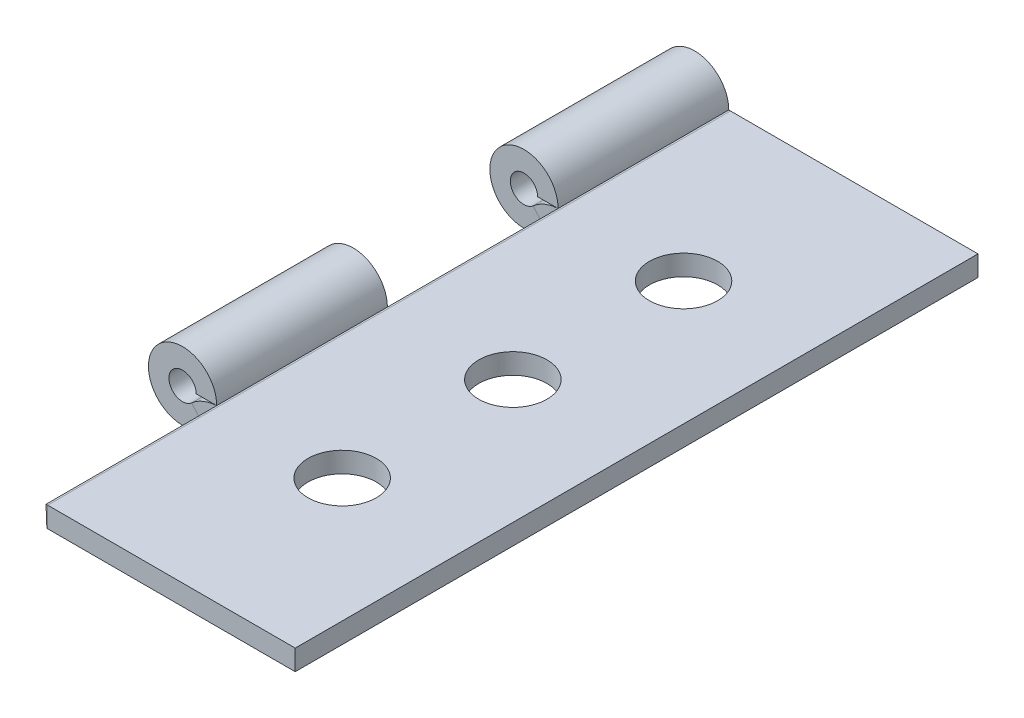
ISO-10303-21;
HEADER;
FILE_DESCRIPTION(('STEP AP214'),'2;1');
FILE_NAME('part.step','',(''),(''),'','','');
FILE_SCHEMA(('AUTOMOTIVE_DESIGN { 1 0 10303 214 1 1 1 1 }'));
ENDSEC;
DATA;
#1=APPLICATION_CONTEXT('core data for automotive mechanical design processes');
#2=APPLICATION_PROTOCOL_DEFINITION('international standard','automotive_design',2000,#1);
#3=PRODUCT_CONTEXT('',#1,'mechanical');
#4=PRODUCT('Part','Part','',(#3));
#5=PRODUCT_RELATED_PRODUCT_CATEGORY('part','',(#4));
#6=PRODUCT_DEFINITION_FORMATION('','',#4);
#7=PRODUCT_DEFINITION_CONTEXT('part definition',#1,'design');
#8=PRODUCT_DEFINITION('design','',#6,#7);
#9=PRODUCT_DEFINITION_SHAPE('','',#8);
#10=(LENGTH_UNIT() NAMED_UNIT(*) SI_UNIT(.MILLI.,.METRE.));
#11=(NAMED_UNIT(*) PLANE_ANGLE_UNIT() SI_UNIT($,.RADIAN.));
#12=(NAMED_UNIT(*) SI_UNIT($,.STERADIAN.) SOLID_ANGLE_UNIT());
#13=UNCERTAINTY_MEASURE_WITH_UNIT(LENGTH_MEASURE(1.E-05),#10,'distance_accuracy_value','');
#14=(GEOMETRIC_REPRESENTATION_CONTEXT(3) GLOBAL_UNCERTAINTY_ASSIGNED_CONTEXT((#13)) GLOBAL_UNIT_ASSIGNED_CONTEXT((#10,
#11,#12)) REPRESENTATION_CONTEXT('',''));
#15=CARTESIAN_POINT('',(0.,0.,0.));
#16=DIRECTION('',(0.,0.,1.));
#17=DIRECTION('',(1.,0.,0.));
#18=AXIS2_PLACEMENT_3D('',#15,#16,#17);
#19=CARTESIAN_POINT('',(-1.016,0.762,25.4));
#20=DIRECTION('',(0.,0.,-1.));
#21=DIRECTION('',(-1.,0.,0.));
#22=AXIS2_PLACEMENT_3D('',#19,#20,#21);
#23=CYLINDRICAL_SURFACE('',#22,0.508);
#24=CARTESIAN_POINT('',(-1.016,0.762,12.7));
#25=DIRECTION('',(0.,0.,-1.));
#26=DIRECTION('',(-1.,0.,0.));
#27=AXIS2_PLACEMENT_3D('',#24,#25,#26);
#28=CIRCLE('',#27,0.508);
#29=CARTESIAN_POINT('',(-0.678175484932944,0.382607594936709,12.7));
#30=VERTEX_POINT('',#29);
#31=CARTESIAN_POINT('',(-0.508,0.762,12.7));
#32=VERTEX_POINT('',#31);
#33=EDGE_CURVE('E173',#30,#32,#28,.T.);
#34=ORIENTED_EDGE('',*,*,#33,.T.);
#35=DIRECTION('',(0.,0.,-1.));
#36=VECTOR('',#35,1.);
#37=CARTESIAN_POINT('',(-0.508,0.762,25.4));
#38=LINE('',#37,#36);
#39=CARTESIAN_POINT('',(-0.508,0.762,19.05));
#40=VERTEX_POINT('',#39);
#41=EDGE_CURVE('E210',#40,#32,#38,.T.);
#42=ORIENTED_EDGE('',*,*,#41,.F.);
#43=CARTESIAN_POINT('',(-1.016,0.762,19.05));
#44=DIRECTION('',(0.,0.,-1.));
#45=DIRECTION('',(-1.,0.,0.));
#46=AXIS2_PLACEMENT_3D('',#43,#44,#45);
#47=CIRCLE('',#46,0.508);
#48=CARTESIAN_POINT('',(-0.678175484932944,0.382607594936709,19.05));
#49=VERTEX_POINT('',#48);
#50=EDGE_CURVE('E307',#40,#49,#47,.F.);
#51=ORIENTED_EDGE('',*,*,#50,.T.);
#52=DIRECTION('',(0.,0.,-1.));
#53=VECTOR('',#52,1.);
#54=CARTESIAN_POINT('',(-0.678175484932944,0.382607594936709,25.4));
#55=LINE('',#54,#53);
#56=EDGE_CURVE('E183',#49,#30,#55,.T.);
#57=ORIENTED_EDGE('',*,*,#56,.T.);
#58=EDGE_LOOP('',(#34,#42,#51,#57));
#59=FACE_BOUND('',#58,.T.);
#60=ADVANCED_FACE('F34',(#59),#23,.F.);
#61=CARTESIAN_POINT('',(-1.016,0.762,6.35000000000002));
#62=DIRECTION('',(0.,0.,-1.));
#63=DIRECTION('',(-1.,0.,0.));
#64=AXIS2_PLACEMENT_3D('',#61,#62,#63);
#65=CIRCLE('',#64,0.508);
#66=CARTESIAN_POINT('',(-0.508,0.762,6.35000000000002));
#67=VERTEX_POINT('',#66);
#68=CARTESIAN_POINT('',(-0.678175484932944,0.382607594936709,6.35000000000001));
#69=VERTEX_POINT('',#68);
#70=EDGE_CURVE('E151',#67,#69,#65,.F.);
#71=ORIENTED_EDGE('',*,*,#70,.T.);
#72=CARTESIAN_POINT('',(-0.678175484932944,0.382607594936709,0.));
#73=VERTEX_POINT('',#72);
#74=EDGE_CURVE('E170',#69,#73,#55,.T.);
#75=ORIENTED_EDGE('',*,*,#74,.T.);
#76=CARTESIAN_POINT('',(-1.016,0.762,0.));
#77=DIRECTION('',(0.,0.,1.));
#78=DIRECTION('',(1.,0.,0.));
#79=AXIS2_PLACEMENT_3D('',#76,#77,#78);
#80=CIRCLE('',#79,0.508);
#81=CARTESIAN_POINT('',(-0.508,0.762,0.));
#82=VERTEX_POINT('',#81);
#83=EDGE_CURVE('E253',#73,#82,#80,.F.);
#84=ORIENTED_EDGE('',*,*,#83,.T.);
#85=EDGE_CURVE('E172',#67,#82,#38,.T.);
#86=ORIENTED_EDGE('',*,*,#85,.F.);
#87=EDGE_LOOP('',(#71,#75,#84,#86));
#88=FACE_BOUND('',#87,.T.);
#89=ADVANCED_FACE('F168',(#88),#23,.F.);
#90=CARTESIAN_POINT('',(0.254,0.762,25.4));
#91=DIRECTION('',(0.,-1.,0.));
#92=DIRECTION('',(1.,0.,0.));
#93=AXIS2_PLACEMENT_3D('',#90,#91,#92);
#94=PLANE('',#93);
#95=ORIENTED_EDGE('',*,*,#41,.T.);
#96=DIRECTION('',(1.,0.,0.));
#97=VECTOR('',#96,1.);
#98=CARTESIAN_POINT('',(0.254,0.762,12.7));
#99=LINE('',#98,#97);
#100=CARTESIAN_POINT('',(0.254,0.762,12.7));
#101=VERTEX_POINT('',#100);
#102=EDGE_CURVE('E164',#101,#32,#99,.F.);
#103=ORIENTED_EDGE('',*,*,#102,.F.);
#104=DIRECTION('',(0.,0.,-1.));
#105=VECTOR('',#104,1.);
#106=CARTESIAN_POINT('',(0.254,0.762,25.4));
#107=LINE('',#106,#105);
#108=CARTESIAN_POINT('',(0.254000000000001,0.762,19.05));
#109=VERTEX_POINT('',#108);
#110=EDGE_CURVE('E207',#109,#101,#107,.T.);
#111=ORIENTED_EDGE('',*,*,#110,.F.);
#112=DIRECTION('',(1.,0.,0.));
#113=VECTOR('',#112,1.);
#114=CARTESIAN_POINT('',(0.254000000000001,0.762,19.05));
#115=LINE('',#114,#113);
#116=EDGE_CURVE('E310',#109,#40,#115,.F.);
#117=ORIENTED_EDGE('',*,*,#116,.T.);
#118=EDGE_LOOP('',(#95,#103,#111,#117));
#119=FACE_BOUND('',#118,.T.);
#120=ADVANCED_FACE('F389',(#119),#94,.T.);
#121=CARTESIAN_POINT('',(0.254000000000001,0.762,6.35000000000001));
#122=VERTEX_POINT('',#121);
#123=CARTESIAN_POINT('',(0.254,0.762,0.));
#124=VERTEX_POINT('',#123);
#125=EDGE_CURVE('E206',#122,#124,#107,.T.);
#126=ORIENTED_EDGE('',*,*,#125,.F.);
#127=DIRECTION('',(1.,0.,0.));
#128=VECTOR('',#127,1.);
#129=CARTESIAN_POINT('',(0.254000000000001,0.762,6.35000000000001));
#130=LINE('',#129,#128);
#131=EDGE_CURVE('E285',#122,#67,#130,.F.);
#132=ORIENTED_EDGE('',*,*,#131,.T.);
#133=ORIENTED_EDGE('',*,*,#85,.T.);
#134=DIRECTION('',(-1.,0.,0.));
#135=VECTOR('',#134,1.);
#136=CARTESIAN_POINT('',(0.254,0.762,0.));
#137=LINE('',#136,#135);
#138=EDGE_CURVE('E255',#124,#82,#137,.T.);
#139=ORIENTED_EDGE('',*,*,#138,.F.);
#140=EDGE_LOOP('',(#126,#132,#133,#139));
#141=FACE_BOUND('',#140,.T.);
#142=ADVANCED_FACE('F284',(#141),#94,.T.);
#143=CARTESIAN_POINT('',(-1.016,0.762,25.4));
#144=DIRECTION('',(0.,0.,-1.));
#145=DIRECTION('',(-1.,0.,0.));
#146=AXIS2_PLACEMENT_3D('',#143,#144,#145);
#147=CYLINDRICAL_SURFACE('',#146,1.27);
#148=ORIENTED_EDGE('',*,*,#110,.T.);
#149=CARTESIAN_POINT('',(-1.016,0.762,12.7));
#150=DIRECTION('',(0.,0.,1.));
#151=DIRECTION('',(1.,0.,0.));
#152=AXIS2_PLACEMENT_3D('',#149,#150,#151);
#153=CIRCLE('',#152,1.27);
#154=CARTESIAN_POINT('',(-0.17143871233236,-0.186481012658228,12.7));
#155=VERTEX_POINT('',#154);
#156=EDGE_CURVE('E174',#155,#101,#153,.F.);
#157=ORIENTED_EDGE('',*,*,#156,.F.);
#158=DIRECTION('',(0.,0.,-1.));
#159=VECTOR('',#158,1.);
#160=CARTESIAN_POINT('',(-0.17143871233236,-0.186481012658228,25.4));
#161=LINE('',#160,#159);
#162=CARTESIAN_POINT('',(-0.17143871233236,-0.186481012658228,19.05));
#163=VERTEX_POINT('',#162);
#164=EDGE_CURVE('E203',#163,#155,#161,.T.);
#165=ORIENTED_EDGE('',*,*,#164,.F.);
#166=CARTESIAN_POINT('',(-1.016,0.762,19.05));
#167=DIRECTION('',(0.,0.,-1.));
#168=DIRECTION('',(-1.,0.,0.));
#169=AXIS2_PLACEMENT_3D('',#166,#167,#168);
#170=CIRCLE('',#169,1.27);
#171=EDGE_CURVE('E305',#109,#163,#170,.F.);
#172=ORIENTED_EDGE('',*,*,#171,.F.);
#173=EDGE_LOOP('',(#148,#157,#165,#172));
#174=FACE_BOUND('',#173,.T.);
#175=ADVANCED_FACE('F333',(#174),#147,.T.);
#176=CARTESIAN_POINT('',(-0.17143871233236,-0.186481012658228,6.35000000000002));
#177=VERTEX_POINT('',#176);
#178=CARTESIAN_POINT('',(-0.17143871233236,-0.186481012658228,0.));
#179=VERTEX_POINT('',#178);
#180=EDGE_CURVE('E202',#177,#179,#161,.T.);
#181=ORIENTED_EDGE('',*,*,#180,.F.);
#182=CARTESIAN_POINT('',(-1.016,0.762,6.35000000000001));
#183=DIRECTION('',(0.,0.,-1.));
#184=DIRECTION('',(-1.,0.,0.));
#185=AXIS2_PLACEMENT_3D('',#182,#183,#184);
#186=CIRCLE('',#185,1.27);
#187=EDGE_CURVE('E153',#122,#177,#186,.F.);
#188=ORIENTED_EDGE('',*,*,#187,.F.);
#189=ORIENTED_EDGE('',*,*,#125,.T.);
#190=CARTESIAN_POINT('',(-1.016,0.762,0.));
#191=DIRECTION('',(0.,0.,-1.));
#192=DIRECTION('',(-1.,0.,0.));
#193=AXIS2_PLACEMENT_3D('',#190,#191,#192);
#194=CIRCLE('',#193,1.27);
#195=EDGE_CURVE('E259',#179,#124,#194,.T.);
#196=ORIENTED_EDGE('',*,*,#195,.F.);
#197=EDGE_LOOP('',(#181,#188,#189,#196));
#198=FACE_BOUND('',#197,.T.);
#199=ADVANCED_FACE('F280',(#198),#147,.T.);
#200=CARTESIAN_POINT('',(0.318406834514872,-0.7366,25.4));
#201=DIRECTION('',(0.,0.,-1.));
#202=DIRECTION('',(-1.,0.,0.));
#203=AXIS2_PLACEMENT_3D('',#200,#201,#202);
#204=CYLINDRICAL_SURFACE('',#203,0.7366);
#205=ORIENTED_EDGE('',*,*,#164,.T.);
#206=CARTESIAN_POINT('',(0.318406834514872,-0.7366,12.7));
#207=DIRECTION('',(0.,0.,-1.));
#208=DIRECTION('',(-1.,0.,0.));
#209=AXIS2_PLACEMENT_3D('',#206,#207,#208);
#210=CIRCLE('',#209,0.7366);
#211=CARTESIAN_POINT('',(0.286749237888918,-0.000680604566051057,12.7));
#212=VERTEX_POINT('',#211);
#213=EDGE_CURVE('E293',#212,#155,#210,.F.);
#214=ORIENTED_EDGE('',*,*,#213,.F.);
#215=DIRECTION('',(0.,0.,-1.));
#216=VECTOR('',#215,1.);
#217=CARTESIAN_POINT('',(0.286749237888917,-0.000680604566051057,25.4));
#218=LINE('',#217,#216);
#219=CARTESIAN_POINT('',(0.286749237888918,-0.000680604566051057,6.35000000000002));
#220=VERTEX_POINT('',#219);
#221=EDGE_CURVE('E155',#220,#212,#218,.F.);
#222=ORIENTED_EDGE('',*,*,#221,.F.);
#223=CARTESIAN_POINT('',(0.318406834514872,-0.7366,6.35000000000002));
#224=DIRECTION('',(0.,0.,-1.));
#225=DIRECTION('',(-1.,0.,0.));
#226=AXIS2_PLACEMENT_3D('',#223,#224,#225);
#227=CIRCLE('',#226,0.7366);
#228=EDGE_CURVE('E275',#177,#220,#227,.T.);
#229=ORIENTED_EDGE('',*,*,#228,.F.);
#230=ORIENTED_EDGE('',*,*,#180,.T.);
#231=CARTESIAN_POINT('',(0.318406834514872,-0.7366,0.));
#232=DIRECTION('',(0.,0.,-1.));
#233=DIRECTION('',(-1.,0.,0.));
#234=AXIS2_PLACEMENT_3D('',#231,#232,#233);
#235=CIRCLE('',#234,0.7366);
#236=CARTESIAN_POINT('',(0.318406834514878,0.,0.));
#237=VERTEX_POINT('',#236);
#238=EDGE_CURVE('E262',#237,#179,#235,.F.);
#239=ORIENTED_EDGE('',*,*,#238,.F.);
#240=DIRECTION('',(0.,0.,-1.));
#241=VECTOR('',#240,1.);
#242=CARTESIAN_POINT('',(0.318406834514878,0.,25.4));
#243=LINE('',#242,#241);
#244=CARTESIAN_POINT('',(0.318406834514878,0.,25.4));
#245=VERTEX_POINT('',#244);
#246=EDGE_CURVE('E199',#245,#237,#243,.T.);
#247=ORIENTED_EDGE('',*,*,#246,.F.);
#248=CARTESIAN_POINT('',(0.318406834514872,-0.7366,25.4));
#249=DIRECTION('',(0.,0.,-1.));
#250=DIRECTION('',(-1.,0.,0.));
#251=AXIS2_PLACEMENT_3D('',#248,#249,#250);
#252=CIRCLE('',#251,0.7366);
#253=CARTESIAN_POINT('',(0.286749237888918,-0.000680604566051057,25.4));
#254=VERTEX_POINT('',#253);
#255=EDGE_CURVE('E235',#245,#254,#252,.F.);
#256=ORIENTED_EDGE('',*,*,#255,.T.);
#257=DIRECTION('',(0.,0.,-1.));
#258=VECTOR('',#257,1.);
#259=CARTESIAN_POINT('',(0.286749237888918,-0.000680604566051057,25.4));
#260=LINE('',#259,#258);
#261=CARTESIAN_POINT('',(0.286749237888918,-0.000680604566051057,19.05));
#262=VERTEX_POINT('',#261);
#263=EDGE_CURVE('E315',#262,#254,#260,.F.);
#264=ORIENTED_EDGE('',*,*,#263,.F.);
#265=CARTESIAN_POINT('',(0.318406834514872,-0.7366,19.05));
#266=DIRECTION('',(0.,0.,-1.));
#267=DIRECTION('',(-1.,0.,0.));
#268=AXIS2_PLACEMENT_3D('',#265,#266,#267);
#269=CIRCLE('',#268,0.7366);
#270=EDGE_CURVE('E317',#163,#262,#269,.T.);
#271=ORIENTED_EDGE('',*,*,#270,.F.);
#272=EDGE_LOOP('',(#205,#214,#222,#229,#230,#239,#247,#256,#264,#271));
#273=FACE_BOUND('',#272,.T.);
#274=ADVANCED_FACE('F272',(#273),#204,.F.);
#275=CARTESIAN_POINT('',(0.318406834514872,-0.7366,25.4));
#276=DIRECTION('',(0.,0.,-1.));
#277=DIRECTION('',(-1.,0.,0.));
#278=AXIS2_PLACEMENT_3D('',#275,#276,#277);
#279=CYLINDRICAL_SURFACE('',#278,1.4986);
#280=CARTESIAN_POINT('',(0.318406834514872,-0.7366,12.7));
#281=DIRECTION('',(0.,0.,1.));
#282=DIRECTION('',(1.,0.,0.));
#283=AXIS2_PLACEMENT_3D('',#280,#281,#282);
#284=CIRCLE('',#283,1.4986);
#285=CARTESIAN_POINT('',(0.254,0.76061532174493,12.7));
#286=VERTEX_POINT('',#285);
#287=EDGE_CURVE('E163',#286,#30,#284,.T.);
#288=ORIENTED_EDGE('',*,*,#287,.T.);
#289=ORIENTED_EDGE('',*,*,#56,.F.);
#290=CARTESIAN_POINT('',(0.318406834514872,-0.7366,19.05));
#291=DIRECTION('',(0.,0.,-1.));
#292=DIRECTION('',(-1.,0.,0.));
#293=AXIS2_PLACEMENT_3D('',#290,#291,#292);
#294=CIRCLE('',#293,1.4986);
#295=CARTESIAN_POINT('',(0.254000000000001,0.76061532174493,19.05));
#296=VERTEX_POINT('',#295);
#297=EDGE_CURVE('E318',#49,#296,#294,.T.);
#298=ORIENTED_EDGE('',*,*,#297,.T.);
#299=DIRECTION('',(0.,0.,-1.));
#300=VECTOR('',#299,1.);
#301=CARTESIAN_POINT('',(0.254,0.76061532174493,25.4));
#302=LINE('',#301,#300);
#303=CARTESIAN_POINT('',(0.254,0.76061532174493,25.4));
#304=VERTEX_POINT('',#303);
#305=EDGE_CURVE('E314',#296,#304,#302,.F.);
#306=ORIENTED_EDGE('',*,*,#305,.T.);
#307=CARTESIAN_POINT('',(0.318406834514872,-0.7366,25.4));
#308=DIRECTION('',(0.,0.,1.));
#309=DIRECTION('',(1.,0.,0.));
#310=AXIS2_PLACEMENT_3D('',#307,#308,#309);
#311=CIRCLE('',#310,1.4986);
#312=CARTESIAN_POINT('',(0.318406834514884,0.762,25.4));
#313=VERTEX_POINT('',#312);
#314=EDGE_CURVE('E184',#313,#304,#311,.T.);
#315=ORIENTED_EDGE('',*,*,#314,.F.);
#316=DIRECTION('',(0.,0.,-1.));
#317=VECTOR('',#316,1.);
#318=CARTESIAN_POINT('',(0.318406834514884,0.762,25.4));
#319=LINE('',#318,#317);
#320=CARTESIAN_POINT('',(0.318406834514884,0.762,0.));
#321=VERTEX_POINT('',#320);
#322=EDGE_CURVE('E187',#313,#321,#319,.T.);
#323=ORIENTED_EDGE('',*,*,#322,.T.);
#324=CARTESIAN_POINT('',(0.318406834514872,-0.7366,0.));
#325=DIRECTION('',(0.,0.,1.));
#326=DIRECTION('',(1.,0.,0.));
#327=AXIS2_PLACEMENT_3D('',#324,#325,#326);
#328=CIRCLE('',#327,1.4986);
#329=EDGE_CURVE('E181',#321,#73,#328,.T.);
#330=ORIENTED_EDGE('',*,*,#329,.T.);
#331=ORIENTED_EDGE('',*,*,#74,.F.);
#332=CARTESIAN_POINT('',(0.318406834514872,-0.7366,6.35000000000001));
#333=DIRECTION('',(0.,0.,-1.));
#334=DIRECTION('',(-1.,0.,0.));
#335=AXIS2_PLACEMENT_3D('',#332,#333,#334);
#336=CIRCLE('',#335,1.4986);
#337=CARTESIAN_POINT('',(0.254000000000001,0.76061532174493,6.35));
#338=VERTEX_POINT('',#337);
#339=EDGE_CURVE('E158',#69,#338,#336,.T.);
#340=ORIENTED_EDGE('',*,*,#339,.T.);
#341=DIRECTION('',(0.,0.,-1.));
#342=VECTOR('',#341,1.);
#343=CARTESIAN_POINT('',(0.253999999999999,0.76061532174493,25.4));
#344=LINE('',#343,#342);
#345=EDGE_CURVE('E294',#338,#286,#344,.F.);
#346=ORIENTED_EDGE('',*,*,#345,.T.);
#347=EDGE_LOOP('',(#288,#289,#298,#306,#315,#323,#330,#331,#340,#346));
#348=FACE_BOUND('',#347,.T.);
#349=ADVANCED_FACE('F178',(#348),#279,.T.);
#350=CARTESIAN_POINT('',(-0.17143871233236,-0.186481012658228,25.4));
#351=DIRECTION('',(0.,0.,1.));
#352=DIRECTION('',(1.,0.,0.));
#353=AXIS2_PLACEMENT_3D('',#350,#351,#352);
#354=PLANE('',#353);
#355=ORIENTED_EDGE('',*,*,#314,.T.);
#356=DIRECTION('',(-0.0429780024788946,0.999076018780815,0.));
#357=VECTOR('',#356,1.);
#358=CARTESIAN_POINT('',(0.254,0.76061532174493,25.4));
#359=LINE('',#358,#357);
#360=EDGE_CURVE('E323',#304,#254,#359,.F.);
#361=ORIENTED_EDGE('',*,*,#360,.T.);
#362=ORIENTED_EDGE('',*,*,#255,.F.);
#363=DIRECTION('',(0.,-1.,0.));
#364=VECTOR('',#363,1.);
#365=CARTESIAN_POINT('',(0.318406834514884,0.762,25.4));
#366=LINE('',#365,#364);
#367=EDGE_CURVE('E11',#313,#245,#366,.T.);
#368=ORIENTED_EDGE('',*,*,#367,.F.);
#369=EDGE_LOOP('',(#355,#361,#362,#368));
#370=FACE_BOUND('',#369,.T.);
#371=ADVANCED_FACE('F36',(#370),#354,.T.);
#372=CARTESIAN_POINT('',(0.318406834514878,0.,0.));
#373=DIRECTION('',(0.,0.,-1.));
#374=DIRECTION('',(-1.,0.,0.));
#375=AXIS2_PLACEMENT_3D('',#372,#373,#374);
#376=PLANE('',#375);
#377=DIRECTION('',(0.,1.,0.));
#378=VECTOR('',#377,1.);
#379=CARTESIAN_POINT('',(0.318406834514878,0.,0.));
#380=LINE('',#379,#378);
#381=EDGE_CURVE('E42',#237,#321,#380,.T.);
#382=ORIENTED_EDGE('',*,*,#381,.F.);
#383=ORIENTED_EDGE('',*,*,#238,.T.);
#384=DIRECTION('',(0.665008887927276,-0.746835443037975,0.));
#385=VECTOR('',#384,1.);
#386=CARTESIAN_POINT('',(-0.678175484932944,0.382607594936709,0.));
#387=LINE('',#386,#385);
#388=EDGE_CURVE('E213',#73,#179,#387,.T.);
#389=ORIENTED_EDGE('',*,*,#388,.F.);
#390=ORIENTED_EDGE('',*,*,#329,.F.);
#391=EDGE_LOOP('',(#382,#383,#389,#390));
#392=FACE_BOUND('',#391,.T.);
#393=ADVANCED_FACE('F234',(#392),#376,.T.);
#394=CARTESIAN_POINT('',(-0.678175484932944,0.382607594936709,0.));
#395=DIRECTION('',(0.,0.,-1.));
#396=DIRECTION('',(-1.,0.,0.));
#397=AXIS2_PLACEMENT_3D('',#394,#395,#396);
#398=PLANE('',#397);
#399=DIRECTION('',(-1.,0.,0.));
#400=VECTOR('',#399,1.);
#401=CARTESIAN_POINT('',(9.525,0.,0.));
#402=LINE('',#401,#400);
#403=CARTESIAN_POINT('',(9.525,0.,0.));
#404=VERTEX_POINT('',#403);
#405=EDGE_CURVE('E224',#404,#237,#402,.T.);
#406=ORIENTED_EDGE('',*,*,#405,.T.);
#407=ORIENTED_EDGE('',*,*,#381,.T.);
#408=DIRECTION('',(-1.,0.,0.));
#409=VECTOR('',#408,1.);
#410=CARTESIAN_POINT('',(9.525,0.762,0.));
#411=LINE('',#410,#409);
#412=CARTESIAN_POINT('',(9.525,0.762,0.));
#413=VERTEX_POINT('',#412);
#414=EDGE_CURVE('E221',#413,#321,#411,.T.);
#415=ORIENTED_EDGE('',*,*,#414,.F.);
#416=DIRECTION('',(0.,-1.,0.));
#417=VECTOR('',#416,1.);
#418=CARTESIAN_POINT('',(9.525,0.762,0.));
#419=LINE('',#418,#417);
#420=EDGE_CURVE('E232',#413,#404,#419,.T.);
#421=ORIENTED_EDGE('',*,*,#420,.T.);
#422=EDGE_LOOP('',(#406,#407,#415,#421));
#423=FACE_BOUND('',#422,.T.);
#424=ADVANCED_FACE('F219',(#423),#398,.T.);
#425=CARTESIAN_POINT('',(9.525,0.,25.4));
#426=DIRECTION('',(0.,-1.,0.));
#427=DIRECTION('',(1.,0.,0.));
#428=AXIS2_PLACEMENT_3D('',#425,#426,#427);
#429=PLANE('',#428);
#430=CARTESIAN_POINT('',(4.92170341725743,0.,19.05));
#431=DIRECTION('',(0.,-1.,0.));
#432=DIRECTION('',(1.,0.,0.));
#433=AXIS2_PLACEMENT_3D('',#430,#431,#432);
#434=CIRCLE('',#433,1.27);
#435=CARTESIAN_POINT('',(6.19170341725743,0.,19.05));
#436=VERTEX_POINT('',#435);
#437=EDGE_CURVE('E352',#436,#436,#434,.T.);
#438=ORIENTED_EDGE('',*,*,#437,.F.);
#439=EDGE_LOOP('',(#438));
#440=FACE_BOUND('',#439,.T.);
#441=CARTESIAN_POINT('',(4.92170341725743,0.,12.7));
#442=DIRECTION('',(0.,-1.,0.));
#443=DIRECTION('',(1.,0.,0.));
#444=AXIS2_PLACEMENT_3D('',#441,#442,#443);
#445=CIRCLE('',#444,1.27000000000001);
#446=CARTESIAN_POINT('',(6.19170341725744,0.,12.7));
#447=VERTEX_POINT('',#446);
#448=EDGE_CURVE('E346',#447,#447,#445,.T.);
#449=ORIENTED_EDGE('',*,*,#448,.F.);
#450=EDGE_LOOP('',(#449));
#451=FACE_BOUND('',#450,.T.);
#452=CARTESIAN_POINT('',(4.92170341725743,0.,6.35));
#453=DIRECTION('',(0.,-1.,0.));
#454=DIRECTION('',(1.,0.,0.));
#455=AXIS2_PLACEMENT_3D('',#452,#453,#454);
#456=CIRCLE('',#455,1.27);
#457=CARTESIAN_POINT('',(6.19170341725743,0.,6.35));
#458=VERTEX_POINT('',#457);
#459=EDGE_CURVE('E338',#458,#458,#456,.T.);
#460=ORIENTED_EDGE('',*,*,#459,.F.);
#461=EDGE_LOOP('',(#460));
#462=FACE_BOUND('',#461,.T.);
#463=ORIENTED_EDGE('',*,*,#405,.F.);
#464=DIRECTION('',(0.,0.,-1.));
#465=VECTOR('',#464,1.);
#466=CARTESIAN_POINT('',(9.525,0.,25.4));
#467=LINE('',#466,#465);
#468=CARTESIAN_POINT('',(9.525,0.,25.4));
#469=VERTEX_POINT('',#468);
#470=EDGE_CURVE('E197',#469,#404,#467,.T.);
#471=ORIENTED_EDGE('',*,*,#470,.F.);
#472=DIRECTION('',(-1.,0.,0.));
#473=VECTOR('',#472,1.);
#474=CARTESIAN_POINT('',(9.525,0.,25.4));
#475=LINE('',#474,#473);
#476=EDGE_CURVE('E237',#469,#245,#475,.T.);
#477=ORIENTED_EDGE('',*,*,#476,.T.);
#478=ORIENTED_EDGE('',*,*,#246,.T.);
#479=EDGE_LOOP('',(#463,#471,#477,#478));
#480=FACE_BOUND('',#479,.T.);
#481=ADVANCED_FACE('F270',(#440,#451,#462,#480),#429,.T.);
#482=CARTESIAN_POINT('',(9.525,0.762,25.4));
#483=DIRECTION('',(1.,0.,0.));
#484=DIRECTION('',(0.,0.,-1.));
#485=AXIS2_PLACEMENT_3D('',#482,#483,#484);
#486=PLANE('',#485);
#487=ORIENTED_EDGE('',*,*,#420,.F.);
#488=DIRECTION('',(0.,0.,-1.));
#489=VECTOR('',#488,1.);
#490=CARTESIAN_POINT('',(9.525,0.762,25.4));
#491=LINE('',#490,#489);
#492=CARTESIAN_POINT('',(9.525,0.762,25.4));
#493=VERTEX_POINT('',#492);
#494=EDGE_CURVE('E195',#493,#413,#491,.T.);
#495=ORIENTED_EDGE('',*,*,#494,.F.);
#496=DIRECTION('',(0.,-1.,0.));
#497=VECTOR('',#496,1.);
#498=CARTESIAN_POINT('',(9.525,0.762,25.4));
#499=LINE('',#498,#497);
#500=EDGE_CURVE('E244',#493,#469,#499,.T.);
#501=ORIENTED_EDGE('',*,*,#500,.T.);
#502=ORIENTED_EDGE('',*,*,#470,.T.);
#503=EDGE_LOOP('',(#487,#495,#501,#502));
#504=FACE_BOUND('',#503,.T.);
#505=ADVANCED_FACE('F266',(#504),#486,.T.);
#506=CARTESIAN_POINT('',(9.525,0.762,25.4));
#507=DIRECTION('',(0.,-1.,0.));
#508=DIRECTION('',(1.,0.,0.));
#509=AXIS2_PLACEMENT_3D('',#506,#507,#508);
#510=PLANE('',#509);
#511=CARTESIAN_POINT('',(4.92170341725743,0.761999999999999,19.05));
#512=DIRECTION('',(0.,1.,0.));
#513=DIRECTION('',(-1.,0.,0.));
#514=AXIS2_PLACEMENT_3D('',#511,#512,#513);
#515=CIRCLE('',#514,1.27);
#516=CARTESIAN_POINT('',(3.65170341725743,0.761999999999999,19.05));
#517=VERTEX_POINT('',#516);
#518=EDGE_CURVE('E355',#517,#517,#515,.T.);
#519=ORIENTED_EDGE('',*,*,#518,.F.);
#520=EDGE_LOOP('',(#519));
#521=FACE_BOUND('',#520,.T.);
#522=CARTESIAN_POINT('',(4.92170341725743,0.761999999999999,12.7));
#523=DIRECTION('',(0.,1.,0.));
#524=DIRECTION('',(-1.,0.,0.));
#525=AXIS2_PLACEMENT_3D('',#522,#523,#524);
#526=CIRCLE('',#525,1.27000000000001);
#527=CARTESIAN_POINT('',(3.65170341725742,0.761999999999999,12.7));
#528=VERTEX_POINT('',#527);
#529=EDGE_CURVE('E349',#528,#528,#526,.T.);
#530=ORIENTED_EDGE('',*,*,#529,.F.);
#531=EDGE_LOOP('',(#530));
#532=FACE_BOUND('',#531,.T.);
#533=CARTESIAN_POINT('',(4.92170341725743,0.761999999999999,6.35));
#534=DIRECTION('',(0.,1.,0.));
#535=DIRECTION('',(-1.,0.,0.));
#536=AXIS2_PLACEMENT_3D('',#533,#534,#535);
#537=CIRCLE('',#536,1.27);
#538=CARTESIAN_POINT('',(3.65170341725743,0.761999999999999,6.35));
#539=VERTEX_POINT('',#538);
#540=EDGE_CURVE('E343',#539,#539,#537,.T.);
#541=ORIENTED_EDGE('',*,*,#540,.F.);
#542=EDGE_LOOP('',(#541));
#543=FACE_BOUND('',#542,.T.);
#544=ORIENTED_EDGE('',*,*,#414,.T.);
#545=ORIENTED_EDGE('',*,*,#322,.F.);
#546=DIRECTION('',(-1.,0.,0.));
#547=VECTOR('',#546,1.);
#548=CARTESIAN_POINT('',(9.525,0.762,25.4));
#549=LINE('',#548,#547);
#550=EDGE_CURVE('E189',#493,#313,#549,.T.);
#551=ORIENTED_EDGE('',*,*,#550,.F.);
#552=ORIENTED_EDGE('',*,*,#494,.T.);
#553=EDGE_LOOP('',(#544,#545,#551,#552));
#554=FACE_BOUND('',#553,.T.);
#555=ADVANCED_FACE('F229',(#521,#532,#543,#554),#510,.F.);
#556=CARTESIAN_POINT('',(-1.016,0.762,25.4));
#557=DIRECTION('',(0.,0.,1.));
#558=DIRECTION('',(1.,0.,0.));
#559=AXIS2_PLACEMENT_3D('',#556,#557,#558);
#560=PLANE('',#559);
#561=ORIENTED_EDGE('',*,*,#550,.T.);
#562=ORIENTED_EDGE('',*,*,#367,.T.);
#563=ORIENTED_EDGE('',*,*,#476,.F.);
#564=ORIENTED_EDGE('',*,*,#500,.F.);
#565=EDGE_LOOP('',(#561,#562,#563,#564));
#566=FACE_BOUND('',#565,.T.);
#567=ADVANCED_FACE('F363',(#566),#560,.T.);
#568=CARTESIAN_POINT('',(-1.016,0.762,0.));
#569=DIRECTION('',(0.,0.,1.));
#570=DIRECTION('',(1.,0.,0.));
#571=AXIS2_PLACEMENT_3D('',#568,#569,#570);
#572=PLANE('',#571);
#573=ORIENTED_EDGE('',*,*,#83,.F.);
#574=ORIENTED_EDGE('',*,*,#388,.T.);
#575=ORIENTED_EDGE('',*,*,#195,.T.);
#576=ORIENTED_EDGE('',*,*,#138,.T.);
#577=EDGE_LOOP('',(#573,#574,#575,#576));
#578=FACE_BOUND('',#577,.T.);
#579=ADVANCED_FACE('F279',(#578),#572,.F.);
#580=CARTESIAN_POINT('',(0.254,0.76061532174493,22.225));
#581=DIRECTION('',(0.999076018780815,0.0429780024788946,0.));
#582=DIRECTION('',(0.,0.,-1.));
#583=AXIS2_PLACEMENT_3D('',#580,#581,#582);
#584=PLANE('',#583);
#585=ORIENTED_EDGE('',*,*,#360,.F.);
#586=ORIENTED_EDGE('',*,*,#305,.F.);
#587=DIRECTION('',(-0.0429780024788941,0.999076018780815,0.));
#588=VECTOR('',#587,1.);
#589=CARTESIAN_POINT('',(0.254000000000001,0.76061532174493,19.05));
#590=LINE('',#589,#588);
#591=EDGE_CURVE('E57',#296,#262,#590,.F.);
#592=ORIENTED_EDGE('',*,*,#591,.T.);
#593=ORIENTED_EDGE('',*,*,#263,.T.);
#594=EDGE_LOOP('',(#585,#586,#592,#593));
#595=FACE_BOUND('',#594,.T.);
#596=ADVANCED_FACE('F409',(#595),#584,.F.);
#597=CARTESIAN_POINT('',(0.318406834514872,-0.7366,19.05));
#598=DIRECTION('',(0.,0.,1.));
#599=DIRECTION('',(1.,0.,0.));
#600=AXIS2_PLACEMENT_3D('',#597,#598,#599);
#601=PLANE('',#600);
#602=ORIENTED_EDGE('',*,*,#297,.F.);
#603=DIRECTION('',(-0.665008887927276,0.746835443037975,0.));
#604=VECTOR('',#603,1.);
#605=CARTESIAN_POINT('',(-0.678175484932944,0.382607594936709,19.05));
#606=LINE('',#605,#604);
#607=EDGE_CURVE('E256',#49,#163,#606,.F.);
#608=ORIENTED_EDGE('',*,*,#607,.T.);
#609=ORIENTED_EDGE('',*,*,#270,.T.);
#610=ORIENTED_EDGE('',*,*,#591,.F.);
#611=EDGE_LOOP('',(#602,#608,#609,#610));
#612=FACE_BOUND('',#611,.T.);
#613=ADVANCED_FACE('F327',(#612),#601,.T.);
#614=CARTESIAN_POINT('',(-1.016,0.762,19.05));
#615=DIRECTION('',(0.,0.,1.));
#616=DIRECTION('',(1.,0.,0.));
#617=AXIS2_PLACEMENT_3D('',#614,#615,#616);
#618=PLANE('',#617);
#619=ORIENTED_EDGE('',*,*,#50,.F.);
#620=ORIENTED_EDGE('',*,*,#116,.F.);
#621=ORIENTED_EDGE('',*,*,#171,.T.);
#622=ORIENTED_EDGE('',*,*,#607,.F.);
#623=EDGE_LOOP('',(#619,#620,#621,#622));
#624=FACE_BOUND('',#623,.T.);
#625=ADVANCED_FACE('F447',(#624),#618,.T.);
#626=CARTESIAN_POINT('',(0.318406834514872,-0.7366,12.7));
#627=DIRECTION('',(0.,0.,-1.));
#628=DIRECTION('',(-1.,0.,0.));
#629=AXIS2_PLACEMENT_3D('',#626,#627,#628);
#630=PLANE('',#629);
#631=DIRECTION('',(-0.665008887927276,0.746835443037975,0.));
#632=VECTOR('',#631,1.);
#633=CARTESIAN_POINT('',(-0.678175484932944,0.382607594936709,12.7));
#634=LINE('',#633,#632);
#635=EDGE_CURVE('E303',#30,#155,#634,.F.);
#636=ORIENTED_EDGE('',*,*,#635,.F.);
#637=ORIENTED_EDGE('',*,*,#287,.F.);
#638=DIRECTION('',(-0.0429780024788946,0.999076018780815,0.));
#639=VECTOR('',#638,1.);
#640=CARTESIAN_POINT('',(0.254,0.76061532174493,12.7));
#641=LINE('',#640,#639);
#642=EDGE_CURVE('E300',#286,#212,#641,.F.);
#643=ORIENTED_EDGE('',*,*,#642,.T.);
#644=ORIENTED_EDGE('',*,*,#213,.T.);
#645=EDGE_LOOP('',(#636,#637,#643,#644));
#646=FACE_BOUND('',#645,.T.);
#647=ADVANCED_FACE('F443',(#646),#630,.T.);
#648=CARTESIAN_POINT('',(0.253999999999999,0.76061532174493,9.52500000000001));
#649=DIRECTION('',(0.999076018780815,0.0429780024788956,0.));
#650=DIRECTION('',(0.,0.,-1.));
#651=AXIS2_PLACEMENT_3D('',#648,#649,#650);
#652=PLANE('',#651);
#653=ORIENTED_EDGE('',*,*,#642,.F.);
#654=ORIENTED_EDGE('',*,*,#345,.F.);
#655=DIRECTION('',(-0.0429780024788941,0.999076018780815,0.));
#656=VECTOR('',#655,1.);
#657=CARTESIAN_POINT('',(0.254000000000001,0.76061532174493,6.35000000000001));
#658=LINE('',#657,#656);
#659=EDGE_CURVE('E49',#338,#220,#658,.F.);
#660=ORIENTED_EDGE('',*,*,#659,.T.);
#661=ORIENTED_EDGE('',*,*,#221,.T.);
#662=EDGE_LOOP('',(#653,#654,#660,#661));
#663=FACE_BOUND('',#662,.T.);
#664=ADVANCED_FACE('F438',(#663),#652,.F.);
#665=CARTESIAN_POINT('',(0.318406834514872,-0.7366,6.35000000000001));
#666=DIRECTION('',(0.,0.,1.));
#667=DIRECTION('',(1.,0.,0.));
#668=AXIS2_PLACEMENT_3D('',#665,#666,#667);
#669=PLANE('',#668);
#670=ORIENTED_EDGE('',*,*,#659,.F.);
#671=ORIENTED_EDGE('',*,*,#339,.F.);
#672=DIRECTION('',(-0.665008887927276,0.746835443037975,0.));
#673=VECTOR('',#672,1.);
#674=CARTESIAN_POINT('',(-0.678175484932944,0.382607594936709,6.35000000000001));
#675=LINE('',#674,#673);
#676=EDGE_CURVE('E147',#69,#177,#675,.F.);
#677=ORIENTED_EDGE('',*,*,#676,.T.);
#678=ORIENTED_EDGE('',*,*,#228,.T.);
#679=EDGE_LOOP('',(#670,#671,#677,#678));
#680=FACE_BOUND('',#679,.T.);
#681=ADVANCED_FACE('F159',(#680),#669,.T.);
#682=CARTESIAN_POINT('',(-1.016,0.762,12.7));
#683=DIRECTION('',(0.,0.,-1.));
#684=DIRECTION('',(-1.,0.,0.));
#685=AXIS2_PLACEMENT_3D('',#682,#683,#684);
#686=PLANE('',#685);
#687=ORIENTED_EDGE('',*,*,#156,.T.);
#688=ORIENTED_EDGE('',*,*,#102,.T.);
#689=ORIENTED_EDGE('',*,*,#33,.F.);
#690=ORIENTED_EDGE('',*,*,#635,.T.);
#691=EDGE_LOOP('',(#687,#688,#689,#690));
#692=FACE_BOUND('',#691,.T.);
#693=ADVANCED_FACE('F380',(#692),#686,.T.);
#694=CARTESIAN_POINT('',(-1.016,0.762,6.35000000000001));
#695=DIRECTION('',(0.,0.,1.));
#696=DIRECTION('',(1.,0.,0.));
#697=AXIS2_PLACEMENT_3D('',#694,#695,#696);
#698=PLANE('',#697);
#699=ORIENTED_EDGE('',*,*,#70,.F.);
#700=ORIENTED_EDGE('',*,*,#131,.F.);
#701=ORIENTED_EDGE('',*,*,#187,.T.);
#702=ORIENTED_EDGE('',*,*,#676,.F.);
#703=EDGE_LOOP('',(#699,#700,#701,#702));
#704=FACE_BOUND('',#703,.T.);
#705=ADVANCED_FACE('F148',(#704),#698,.T.);
#706=CARTESIAN_POINT('',(4.92170341725743,-0.508000000000001,6.35));
#707=DIRECTION('',(0.,1.,0.));
#708=DIRECTION('',(-1.,0.,0.));
#709=AXIS2_PLACEMENT_3D('',#706,#707,#708);
#710=CYLINDRICAL_SURFACE('',#709,1.27);
#711=ORIENTED_EDGE('',*,*,#459,.T.);
#712=EDGE_LOOP('',(#711));
#713=FACE_BOUND('',#712,.T.);
#714=ORIENTED_EDGE('',*,*,#540,.T.);
#715=EDGE_LOOP('',(#714));
#716=FACE_BOUND('',#715,.T.);
#717=ADVANCED_FACE('F369',(#713,#716),#710,.F.);
#718=CARTESIAN_POINT('',(4.92170341725743,-0.508000000000001,12.7));
#719=DIRECTION('',(0.,1.,0.));
#720=DIRECTION('',(-1.,0.,0.));
#721=AXIS2_PLACEMENT_3D('',#718,#719,#720);
#722=CYLINDRICAL_SURFACE('',#721,1.27000000000001);
#723=ORIENTED_EDGE('',*,*,#448,.T.);
#724=EDGE_LOOP('',(#723));
#725=FACE_BOUND('',#724,.T.);
#726=ORIENTED_EDGE('',*,*,#529,.T.);
#727=EDGE_LOOP('',(#726));
#728=FACE_BOUND('',#727,.T.);
#729=ADVANCED_FACE('F371',(#725,#728),#722,.F.);
#730=CARTESIAN_POINT('',(4.92170341725743,-0.508000000000001,19.05));
#731=DIRECTION('',(0.,1.,0.));
#732=DIRECTION('',(-1.,0.,0.));
#733=AXIS2_PLACEMENT_3D('',#730,#731,#732);
#734=CYLINDRICAL_SURFACE('',#733,1.27);
#735=ORIENTED_EDGE('',*,*,#437,.T.);
#736=EDGE_LOOP('',(#735));
#737=FACE_BOUND('',#736,.T.);
#738=ORIENTED_EDGE('',*,*,#518,.T.);
#739=EDGE_LOOP('',(#738));
#740=FACE_BOUND('',#739,.T.);
#741=ADVANCED_FACE('F359',(#737,#740),#734,.F.);
#742=CLOSED_SHELL('',(#60,#89,#120,#142,#175,#199,#274,#349,#371,#393,#424,#481,#505,#555,#567,
#579,#596,#613,#625,#647,#664,#681,#693,#705,#717,#729,#741));
#743=MANIFOLD_SOLID_BREP('B2',#742);
#744=ADVANCED_BREP_SHAPE_REPRESENTATION('',(#18,#743),#14);
#745=SHAPE_DEFINITION_REPRESENTATION(#9,#744);
ENDSEC;
END-ISO-10303-21;
